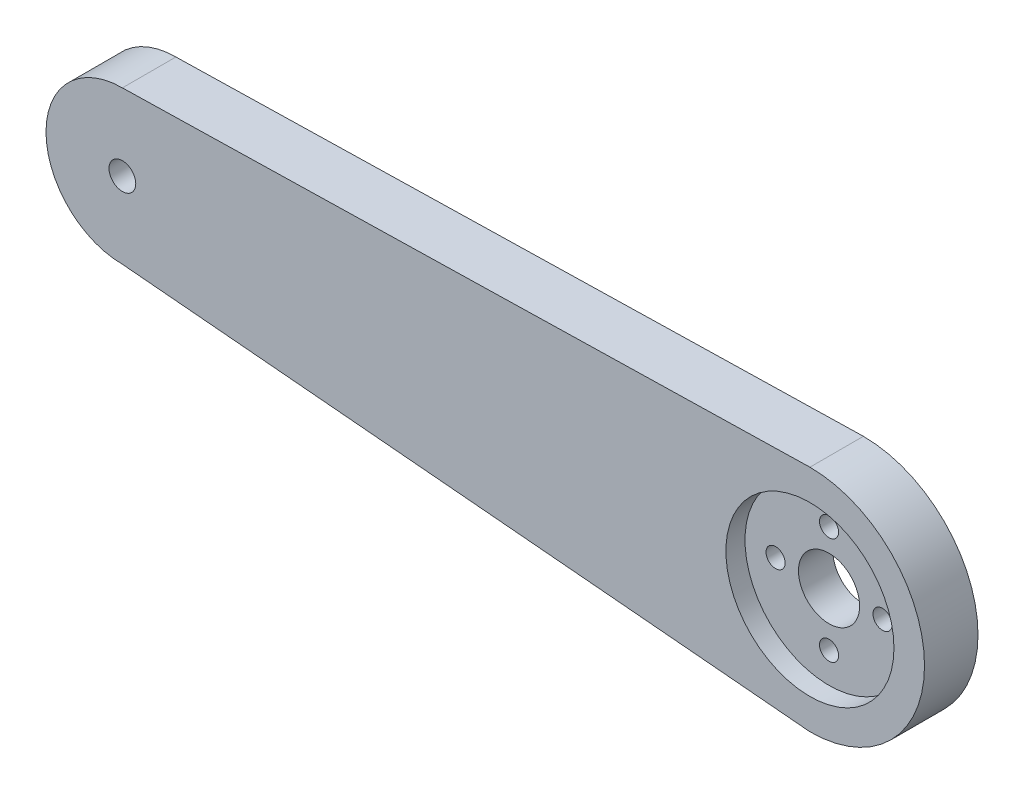
ISO-10303-21;
HEADER;
FILE_DESCRIPTION(('STEP AP214'),'2;1');
FILE_NAME('part.step','',(''),(''),'','','');
FILE_SCHEMA(('AUTOMOTIVE_DESIGN { 1 0 10303 214 1 1 1 1 }'));
ENDSEC;
DATA;
#1=APPLICATION_CONTEXT('core data for automotive mechanical design processes');
#2=APPLICATION_PROTOCOL_DEFINITION('international standard','automotive_design',2000,#1);
#3=PRODUCT_CONTEXT('',#1,'mechanical');
#4=PRODUCT('Part','Part','',(#3));
#5=PRODUCT_RELATED_PRODUCT_CATEGORY('part','',(#4));
#6=PRODUCT_DEFINITION_FORMATION('','',#4);
#7=PRODUCT_DEFINITION_CONTEXT('part definition',#1,'design');
#8=PRODUCT_DEFINITION('design','',#6,#7);
#9=PRODUCT_DEFINITION_SHAPE('','',#8);
#10=(LENGTH_UNIT() NAMED_UNIT(*) SI_UNIT(.MILLI.,.METRE.));
#11=(NAMED_UNIT(*) PLANE_ANGLE_UNIT() SI_UNIT($,.RADIAN.));
#12=(NAMED_UNIT(*) SI_UNIT($,.STERADIAN.) SOLID_ANGLE_UNIT());
#13=UNCERTAINTY_MEASURE_WITH_UNIT(LENGTH_MEASURE(1.E-05),#10,'distance_accuracy_value','');
#14=(GEOMETRIC_REPRESENTATION_CONTEXT(3) GLOBAL_UNCERTAINTY_ASSIGNED_CONTEXT((#13)) GLOBAL_UNIT_ASSIGNED_CONTEXT((#10,
#11,#12)) REPRESENTATION_CONTEXT('',''));
#15=CARTESIAN_POINT('',(0.,0.,0.));
#16=DIRECTION('',(0.,0.,1.));
#17=DIRECTION('',(1.,0.,0.));
#18=AXIS2_PLACEMENT_3D('',#15,#16,#17);
#19=CARTESIAN_POINT('',(0.,0.,-3.));
#20=DIRECTION('',(0.,0.,1.));
#21=DIRECTION('',(1.,0.,0.));
#22=AXIS2_PLACEMENT_3D('',#19,#20,#21);
#23=CYLINDRICAL_SURFACE('',#22,1.75);
#24=CARTESIAN_POINT('',(0.,0.,7.));
#25=DIRECTION('',(0.,0.,1.));
#26=DIRECTION('',(1.,0.,0.));
#27=AXIS2_PLACEMENT_3D('',#24,#25,#26);
#28=CIRCLE('',#27,1.75);
#29=CARTESIAN_POINT('',(1.75,0.,7.));
#30=VERTEX_POINT('',#29);
#31=EDGE_CURVE('E126',#30,#30,#28,.T.);
#32=ORIENTED_EDGE('',*,*,#31,.T.);
#33=EDGE_LOOP('',(#32));
#34=FACE_BOUND('',#33,.T.);
#35=CARTESIAN_POINT('',(0.,0.,3.));
#36=DIRECTION('',(0.,0.,-1.));
#37=DIRECTION('',(-1.,0.,0.));
#38=AXIS2_PLACEMENT_3D('',#35,#36,#37);
#39=CIRCLE('',#38,1.75);
#40=CARTESIAN_POINT('',(-1.75,0.,3.));
#41=VERTEX_POINT('',#40);
#42=EDGE_CURVE('E40',#41,#41,#39,.F.);
#43=ORIENTED_EDGE('',*,*,#42,.F.);
#44=EDGE_LOOP('',(#43));
#45=FACE_BOUND('',#44,.T.);
#46=ADVANCED_FACE('F36',(#34,#45),#23,.F.);
#47=CARTESIAN_POINT('',(90.,-3.00000000000001,10.));
#48=DIRECTION('',(0.,0.,-1.));
#49=DIRECTION('',(-1.,0.,0.));
#50=AXIS2_PLACEMENT_3D('',#47,#48,#49);
#51=CYLINDRICAL_SURFACE('',#50,4.00000000000001);
#52=CARTESIAN_POINT('',(90.,-3.00000000000001,0.));
#53=DIRECTION('',(0.,0.,-1.));
#54=DIRECTION('',(-1.,0.,0.));
#55=AXIS2_PLACEMENT_3D('',#52,#53,#54);
#56=CIRCLE('',#55,4.00000000000001);
#57=CARTESIAN_POINT('',(86.,-3.00000000000001,0.));
#58=VERTEX_POINT('',#57);
#59=EDGE_CURVE('E106',#58,#58,#56,.T.);
#60=ORIENTED_EDGE('',*,*,#59,.T.);
#61=EDGE_LOOP('',(#60));
#62=FACE_BOUND('',#61,.T.);
#63=CARTESIAN_POINT('',(90.,-3.00000000000001,4.5));
#64=DIRECTION('',(0.,0.,1.));
#65=DIRECTION('',(1.,0.,0.));
#66=AXIS2_PLACEMENT_3D('',#63,#64,#65);
#67=CIRCLE('',#66,4.00000000000001);
#68=CARTESIAN_POINT('',(94.,-3.00000000000001,4.5));
#69=VERTEX_POINT('',#68);
#70=EDGE_CURVE('E136',#69,#69,#67,.F.);
#71=ORIENTED_EDGE('',*,*,#70,.F.);
#72=EDGE_LOOP('',(#71));
#73=FACE_BOUND('',#72,.T.);
#74=ADVANCED_FACE('F154',(#62,#73),#51,.F.);
#75=CARTESIAN_POINT('',(90.,3.99999999999999,10.));
#76=DIRECTION('',(0.,0.,-1.));
#77=DIRECTION('',(-1.,0.,0.));
#78=AXIS2_PLACEMENT_3D('',#75,#76,#77);
#79=CYLINDRICAL_SURFACE('',#78,1.25);
#80=CARTESIAN_POINT('',(90.,3.99999999999999,0.));
#81=DIRECTION('',(0.,0.,-1.));
#82=DIRECTION('',(-1.,0.,0.));
#83=AXIS2_PLACEMENT_3D('',#80,#81,#82);
#84=CIRCLE('',#83,1.25);
#85=CARTESIAN_POINT('',(88.75,3.99999999999999,0.));
#86=VERTEX_POINT('',#85);
#87=EDGE_CURVE('E144',#86,#86,#84,.T.);
#88=ORIENTED_EDGE('',*,*,#87,.T.);
#89=EDGE_LOOP('',(#88));
#90=FACE_BOUND('',#89,.T.);
#91=CARTESIAN_POINT('',(90.,3.99999999999999,4.5));
#92=DIRECTION('',(0.,0.,1.));
#93=DIRECTION('',(1.,0.,0.));
#94=AXIS2_PLACEMENT_3D('',#91,#92,#93);
#95=CIRCLE('',#94,1.25);
#96=CARTESIAN_POINT('',(91.25,3.99999999999999,4.5));
#97=VERTEX_POINT('',#96);
#98=EDGE_CURVE('E133',#97,#97,#95,.F.);
#99=ORIENTED_EDGE('',*,*,#98,.F.);
#100=EDGE_LOOP('',(#99));
#101=FACE_BOUND('',#100,.T.);
#102=ADVANCED_FACE('F181',(#90,#101),#79,.F.);
#103=CARTESIAN_POINT('',(83.,-3.00000000000001,10.));
#104=DIRECTION('',(0.,0.,-1.));
#105=DIRECTION('',(-1.,0.,0.));
#106=AXIS2_PLACEMENT_3D('',#103,#104,#105);
#107=CYLINDRICAL_SURFACE('',#106,1.25);
#108=CARTESIAN_POINT('',(83.,-3.00000000000001,0.));
#109=DIRECTION('',(0.,0.,-1.));
#110=DIRECTION('',(-1.,0.,0.));
#111=AXIS2_PLACEMENT_3D('',#108,#109,#110);
#112=CIRCLE('',#111,1.25);
#113=CARTESIAN_POINT('',(81.75,-3.00000000000001,0.));
#114=VERTEX_POINT('',#113);
#115=EDGE_CURVE('E140',#114,#114,#112,.T.);
#116=ORIENTED_EDGE('',*,*,#115,.T.);
#117=EDGE_LOOP('',(#116));
#118=FACE_BOUND('',#117,.T.);
#119=CARTESIAN_POINT('',(83.,-3.00000000000001,4.5));
#120=DIRECTION('',(0.,0.,1.));
#121=DIRECTION('',(1.,0.,0.));
#122=AXIS2_PLACEMENT_3D('',#119,#120,#121);
#123=CIRCLE('',#122,1.25);
#124=CARTESIAN_POINT('',(84.25,-3.00000000000001,4.5));
#125=VERTEX_POINT('',#124);
#126=EDGE_CURVE('E118',#125,#125,#123,.F.);
#127=ORIENTED_EDGE('',*,*,#126,.F.);
#128=EDGE_LOOP('',(#127));
#129=FACE_BOUND('',#128,.T.);
#130=ADVANCED_FACE('F196',(#118,#129),#107,.F.);
#131=CARTESIAN_POINT('',(90.,-10.,10.));
#132=DIRECTION('',(0.,0.,-1.));
#133=DIRECTION('',(-1.,0.,0.));
#134=AXIS2_PLACEMENT_3D('',#131,#132,#133);
#135=CYLINDRICAL_SURFACE('',#134,1.25);
#136=CARTESIAN_POINT('',(90.,-10.,0.));
#137=DIRECTION('',(0.,0.,-1.));
#138=DIRECTION('',(-1.,0.,0.));
#139=AXIS2_PLACEMENT_3D('',#136,#137,#138);
#140=CIRCLE('',#139,1.25);
#141=CARTESIAN_POINT('',(88.75,-10.,0.));
#142=VERTEX_POINT('',#141);
#143=EDGE_CURVE('E143',#142,#142,#140,.T.);
#144=ORIENTED_EDGE('',*,*,#143,.T.);
#145=EDGE_LOOP('',(#144));
#146=FACE_BOUND('',#145,.T.);
#147=CARTESIAN_POINT('',(90.,-10.,4.5));
#148=DIRECTION('',(0.,0.,1.));
#149=DIRECTION('',(1.,0.,0.));
#150=AXIS2_PLACEMENT_3D('',#147,#148,#149);
#151=CIRCLE('',#150,1.25);
#152=CARTESIAN_POINT('',(91.25,-10.,4.5));
#153=VERTEX_POINT('',#152);
#154=EDGE_CURVE('E113',#153,#153,#151,.F.);
#155=ORIENTED_EDGE('',*,*,#154,.F.);
#156=EDGE_LOOP('',(#155));
#157=FACE_BOUND('',#156,.T.);
#158=ADVANCED_FACE('F199',(#146,#157),#135,.F.);
#159=CARTESIAN_POINT('',(97.,-3.,10.));
#160=DIRECTION('',(0.,0.,-1.));
#161=DIRECTION('',(-1.,0.,0.));
#162=AXIS2_PLACEMENT_3D('',#159,#160,#161);
#163=CYLINDRICAL_SURFACE('',#162,1.25);
#164=CARTESIAN_POINT('',(97.,-3.,0.));
#165=DIRECTION('',(0.,0.,-1.));
#166=DIRECTION('',(-1.,0.,0.));
#167=AXIS2_PLACEMENT_3D('',#164,#165,#166);
#168=CIRCLE('',#167,1.25);
#169=CARTESIAN_POINT('',(95.75,-3.,0.));
#170=VERTEX_POINT('',#169);
#171=EDGE_CURVE('E139',#170,#170,#168,.T.);
#172=ORIENTED_EDGE('',*,*,#171,.T.);
#173=EDGE_LOOP('',(#172));
#174=FACE_BOUND('',#173,.T.);
#175=CARTESIAN_POINT('',(97.,-3.,4.5));
#176=DIRECTION('',(0.,0.,1.));
#177=DIRECTION('',(1.,0.,0.));
#178=AXIS2_PLACEMENT_3D('',#175,#176,#177);
#179=CIRCLE('',#178,1.25);
#180=CARTESIAN_POINT('',(98.25,-3.,4.5));
#181=VERTEX_POINT('',#180);
#182=EDGE_CURVE('E111',#181,#181,#179,.F.);
#183=ORIENTED_EDGE('',*,*,#182,.F.);
#184=EDGE_LOOP('',(#183));
#185=FACE_BOUND('',#184,.T.);
#186=ADVANCED_FACE('F206',(#174,#185),#163,.F.);
#187=CARTESIAN_POINT('',(0.,0.,7.));
#188=DIRECTION('',(0.,0.,-1.));
#189=DIRECTION('',(-1.,0.,0.));
#190=AXIS2_PLACEMENT_3D('',#187,#188,#189);
#191=CYLINDRICAL_SURFACE('',#190,10.);
#192=CARTESIAN_POINT('',(0.,0.,0.));
#193=DIRECTION('',(0.,0.,1.));
#194=DIRECTION('',(1.,0.,0.));
#195=AXIS2_PLACEMENT_3D('',#192,#193,#194);
#196=CIRCLE('',#195,10.);
#197=CARTESIAN_POINT('',(0.,10.,0.));
#198=VERTEX_POINT('',#197);
#199=CARTESIAN_POINT('',(0.,-10.,0.));
#200=VERTEX_POINT('',#199);
#201=EDGE_CURVE('E103',#198,#200,#196,.T.);
#202=ORIENTED_EDGE('',*,*,#201,.T.);
#203=DIRECTION('',(0.,0.,-1.));
#204=VECTOR('',#203,1.);
#205=CARTESIAN_POINT('',(0.,-10.,7.));
#206=LINE('',#205,#204);
#207=CARTESIAN_POINT('',(0.,-10.,7.));
#208=VERTEX_POINT('',#207);
#209=EDGE_CURVE('E11',#208,#200,#206,.T.);
#210=ORIENTED_EDGE('',*,*,#209,.F.);
#211=CARTESIAN_POINT('',(0.,0.,7.));
#212=DIRECTION('',(0.,0.,1.));
#213=DIRECTION('',(1.,0.,0.));
#214=AXIS2_PLACEMENT_3D('',#211,#212,#213);
#215=CIRCLE('',#214,10.);
#216=CARTESIAN_POINT('',(0.,10.,7.));
#217=VERTEX_POINT('',#216);
#218=EDGE_CURVE('E90',#217,#208,#215,.T.);
#219=ORIENTED_EDGE('',*,*,#218,.F.);
#220=DIRECTION('',(0.,0.,-1.));
#221=VECTOR('',#220,1.);
#222=CARTESIAN_POINT('',(0.,10.,7.));
#223=LINE('',#222,#221);
#224=EDGE_CURVE('E99',#217,#198,#223,.T.);
#225=ORIENTED_EDGE('',*,*,#224,.T.);
#226=EDGE_LOOP('',(#202,#210,#219,#225));
#227=FACE_BOUND('',#226,.T.);
#228=ADVANCED_FACE('F38',(#227),#191,.T.);
#229=CARTESIAN_POINT('',(0.,-10.,7.));
#230=DIRECTION('',(0.0885397902837944,0.996072640692687,0.));
#231=DIRECTION('',(-0.996072640692687,0.0885397902837944,0.));
#232=AXIS2_PLACEMENT_3D('',#229,#230,#231);
#233=PLANE('',#232);
#234=DIRECTION('',(0.996072640692687,-0.0885397902837944,0.));
#235=VECTOR('',#234,1.);
#236=CARTESIAN_POINT('',(0.,-10.,0.));
#237=LINE('',#236,#235);
#238=CARTESIAN_POINT('',(90.,-18.,0.));
#239=VERTEX_POINT('',#238);
#240=EDGE_CURVE('E94',#200,#239,#237,.T.);
#241=ORIENTED_EDGE('',*,*,#240,.T.);
#242=DIRECTION('',(0.,0.,-1.));
#243=VECTOR('',#242,1.);
#244=CARTESIAN_POINT('',(90.,-18.,7.));
#245=LINE('',#244,#243);
#246=CARTESIAN_POINT('',(90.,-18.,7.));
#247=VERTEX_POINT('',#246);
#248=EDGE_CURVE('E46',#247,#239,#245,.T.);
#249=ORIENTED_EDGE('',*,*,#248,.F.);
#250=DIRECTION('',(0.996072640692687,-0.0885397902837944,0.));
#251=VECTOR('',#250,1.);
#252=CARTESIAN_POINT('',(0.,-10.,7.));
#253=LINE('',#252,#251);
#254=EDGE_CURVE('E85',#208,#247,#253,.T.);
#255=ORIENTED_EDGE('',*,*,#254,.F.);
#256=ORIENTED_EDGE('',*,*,#209,.T.);
#257=EDGE_LOOP('',(#241,#249,#255,#256));
#258=FACE_BOUND('',#257,.T.);
#259=ADVANCED_FACE('F93',(#258),#233,.F.);
#260=CARTESIAN_POINT('',(90.,-3.00000000000001,7.));
#261=DIRECTION('',(0.,0.,-1.));
#262=DIRECTION('',(-1.,0.,0.));
#263=AXIS2_PLACEMENT_3D('',#260,#261,#262);
#264=CYLINDRICAL_SURFACE('',#263,15.);
#265=CARTESIAN_POINT('',(90.,-3.00000000000001,0.));
#266=DIRECTION('',(0.,0.,1.));
#267=DIRECTION('',(1.,0.,0.));
#268=AXIS2_PLACEMENT_3D('',#265,#266,#267);
#269=CIRCLE('',#268,15.);
#270=CARTESIAN_POINT('',(90.,12.,0.));
#271=VERTEX_POINT('',#270);
#272=EDGE_CURVE('E72',#239,#271,#269,.T.);
#273=ORIENTED_EDGE('',*,*,#272,.T.);
#274=DIRECTION('',(0.,0.,-1.));
#275=VECTOR('',#274,1.);
#276=CARTESIAN_POINT('',(90.,12.,7.));
#277=LINE('',#276,#275);
#278=CARTESIAN_POINT('',(90.,12.,7.));
#279=VERTEX_POINT('',#278);
#280=EDGE_CURVE('E95',#279,#271,#277,.T.);
#281=ORIENTED_EDGE('',*,*,#280,.F.);
#282=CARTESIAN_POINT('',(90.,-3.00000000000001,7.));
#283=DIRECTION('',(0.,0.,1.));
#284=DIRECTION('',(1.,0.,0.));
#285=AXIS2_PLACEMENT_3D('',#282,#283,#284);
#286=CIRCLE('',#285,15.);
#287=EDGE_CURVE('E88',#247,#279,#286,.T.);
#288=ORIENTED_EDGE('',*,*,#287,.F.);
#289=ORIENTED_EDGE('',*,*,#248,.T.);
#290=EDGE_LOOP('',(#273,#281,#288,#289));
#291=FACE_BOUND('',#290,.T.);
#292=ADVANCED_FACE('F97',(#291),#264,.T.);
#293=CARTESIAN_POINT('',(0.,10.,7.));
#294=DIRECTION('',(0.0222167372851468,-0.99975317783161,0.));
#295=DIRECTION('',(0.99975317783161,0.0222167372851468,0.));
#296=AXIS2_PLACEMENT_3D('',#293,#294,#295);
#297=PLANE('',#296);
#298=DIRECTION('',(-0.99975317783161,-0.0222167372851468,0.));
#299=VECTOR('',#298,1.);
#300=CARTESIAN_POINT('',(0.,10.,0.));
#301=LINE('',#300,#299);
#302=EDGE_CURVE('E78',#271,#198,#301,.T.);
#303=ORIENTED_EDGE('',*,*,#302,.T.);
#304=ORIENTED_EDGE('',*,*,#224,.F.);
#305=DIRECTION('',(-0.99975317783161,-0.0222167372851468,0.));
#306=VECTOR('',#305,1.);
#307=CARTESIAN_POINT('',(0.,10.,7.));
#308=LINE('',#307,#306);
#309=EDGE_CURVE('E55',#279,#217,#308,.T.);
#310=ORIENTED_EDGE('',*,*,#309,.F.);
#311=ORIENTED_EDGE('',*,*,#280,.T.);
#312=EDGE_LOOP('',(#303,#304,#310,#311));
#313=FACE_BOUND('',#312,.T.);
#314=ADVANCED_FACE('F165',(#313),#297,.F.);
#315=CARTESIAN_POINT('',(0.,0.,7.));
#316=DIRECTION('',(0.,0.,1.));
#317=DIRECTION('',(1.,0.,0.));
#318=AXIS2_PLACEMENT_3D('',#315,#316,#317);
#319=PLANE('',#318);
#320=ORIENTED_EDGE('',*,*,#31,.F.);
#321=EDGE_LOOP('',(#320));
#322=FACE_BOUND('',#321,.T.);
#323=CARTESIAN_POINT('',(90.,-3.00000000000001,7.));
#324=DIRECTION('',(0.,0.,1.));
#325=DIRECTION('',(1.,0.,0.));
#326=AXIS2_PLACEMENT_3D('',#323,#324,#325);
#327=CIRCLE('',#326,11.);
#328=CARTESIAN_POINT('',(101.,-3.00000000000001,7.));
#329=VERTEX_POINT('',#328);
#330=EDGE_CURVE('E121',#329,#329,#327,.T.);
#331=ORIENTED_EDGE('',*,*,#330,.F.);
#332=EDGE_LOOP('',(#331));
#333=FACE_BOUND('',#332,.T.);
#334=ORIENTED_EDGE('',*,*,#218,.T.);
#335=ORIENTED_EDGE('',*,*,#254,.T.);
#336=ORIENTED_EDGE('',*,*,#287,.T.);
#337=ORIENTED_EDGE('',*,*,#309,.T.);
#338=EDGE_LOOP('',(#334,#335,#336,#337));
#339=FACE_BOUND('',#338,.T.);
#340=ADVANCED_FACE('F86',(#322,#333,#339),#319,.T.);
#341=CARTESIAN_POINT('',(0.,0.,0.));
#342=DIRECTION('',(0.,0.,1.));
#343=DIRECTION('',(1.,0.,0.));
#344=AXIS2_PLACEMENT_3D('',#341,#342,#343);
#345=PLANE('',#344);
#346=CARTESIAN_POINT('',(0.,0.,0.));
#347=DIRECTION('',(0.,0.,-1.));
#348=DIRECTION('',(-1.,0.,0.));
#349=AXIS2_PLACEMENT_3D('',#346,#347,#348);
#350=CIRCLE('',#349,4.01);
#351=CARTESIAN_POINT('',(-4.01,0.,0.));
#352=VERTEX_POINT('',#351);
#353=EDGE_CURVE('E330',#352,#352,#350,.T.);
#354=ORIENTED_EDGE('',*,*,#353,.F.);
#355=EDGE_LOOP('',(#354));
#356=FACE_BOUND('',#355,.T.);
#357=ORIENTED_EDGE('',*,*,#171,.F.);
#358=EDGE_LOOP('',(#357));
#359=FACE_BOUND('',#358,.T.);
#360=ORIENTED_EDGE('',*,*,#143,.F.);
#361=EDGE_LOOP('',(#360));
#362=FACE_BOUND('',#361,.T.);
#363=ORIENTED_EDGE('',*,*,#115,.F.);
#364=EDGE_LOOP('',(#363));
#365=FACE_BOUND('',#364,.T.);
#366=ORIENTED_EDGE('',*,*,#87,.F.);
#367=EDGE_LOOP('',(#366));
#368=FACE_BOUND('',#367,.T.);
#369=ORIENTED_EDGE('',*,*,#59,.F.);
#370=EDGE_LOOP('',(#369));
#371=FACE_BOUND('',#370,.T.);
#372=ORIENTED_EDGE('',*,*,#201,.F.);
#373=ORIENTED_EDGE('',*,*,#302,.F.);
#374=ORIENTED_EDGE('',*,*,#272,.F.);
#375=ORIENTED_EDGE('',*,*,#240,.F.);
#376=EDGE_LOOP('',(#372,#373,#374,#375));
#377=FACE_BOUND('',#376,.T.);
#378=ADVANCED_FACE('F157',(#356,#359,#362,#365,#368,#371,#377),#345,.F.);
#379=CARTESIAN_POINT('',(90.,-3.00000000000001,4.5));
#380=DIRECTION('',(0.,0.,1.));
#381=DIRECTION('',(1.,0.,0.));
#382=AXIS2_PLACEMENT_3D('',#379,#380,#381);
#383=PLANE('',#382);
#384=CARTESIAN_POINT('',(90.,-3.00000000000001,4.5));
#385=DIRECTION('',(0.,0.,1.));
#386=DIRECTION('',(1.,0.,0.));
#387=AXIS2_PLACEMENT_3D('',#384,#385,#386);
#388=CIRCLE('',#387,11.);
#389=CARTESIAN_POINT('',(101.,-3.00000000000001,4.5));
#390=VERTEX_POINT('',#389);
#391=EDGE_CURVE('E114',#390,#390,#388,.T.);
#392=ORIENTED_EDGE('',*,*,#391,.T.);
#393=EDGE_LOOP('',(#392));
#394=FACE_BOUND('',#393,.T.);
#395=ORIENTED_EDGE('',*,*,#182,.T.);
#396=EDGE_LOOP('',(#395));
#397=FACE_BOUND('',#396,.T.);
#398=ORIENTED_EDGE('',*,*,#154,.T.);
#399=EDGE_LOOP('',(#398));
#400=FACE_BOUND('',#399,.T.);
#401=ORIENTED_EDGE('',*,*,#126,.T.);
#402=EDGE_LOOP('',(#401));
#403=FACE_BOUND('',#402,.T.);
#404=ORIENTED_EDGE('',*,*,#98,.T.);
#405=EDGE_LOOP('',(#404));
#406=FACE_BOUND('',#405,.T.);
#407=ORIENTED_EDGE('',*,*,#70,.T.);
#408=EDGE_LOOP('',(#407));
#409=FACE_BOUND('',#408,.T.);
#410=ADVANCED_FACE('F160',(#394,#397,#400,#403,#406,#409),#383,.T.);
#411=CARTESIAN_POINT('',(90.,-3.00000000000001,4.5));
#412=DIRECTION('',(0.,0.,1.));
#413=DIRECTION('',(1.,0.,0.));
#414=AXIS2_PLACEMENT_3D('',#411,#412,#413);
#415=CYLINDRICAL_SURFACE('',#414,11.);
#416=ORIENTED_EDGE('',*,*,#391,.F.);
#417=EDGE_LOOP('',(#416));
#418=FACE_BOUND('',#417,.T.);
#419=ORIENTED_EDGE('',*,*,#330,.T.);
#420=EDGE_LOOP('',(#419));
#421=FACE_BOUND('',#420,.T.);
#422=ADVANCED_FACE('F191',(#418,#421),#415,.F.);
#423=CARTESIAN_POINT('',(0.,0.,3.));
#424=DIRECTION('',(0.,0.,-1.));
#425=DIRECTION('',(-1.,0.,0.));
#426=AXIS2_PLACEMENT_3D('',#423,#424,#425);
#427=PLANE('',#426);
#428=CARTESIAN_POINT('',(0.,0.,3.));
#429=DIRECTION('',(0.,0.,-1.));
#430=DIRECTION('',(-1.,0.,0.));
#431=AXIS2_PLACEMENT_3D('',#428,#429,#430);
#432=CIRCLE('',#431,4.01);
#433=CARTESIAN_POINT('',(-4.01,0.,3.));
#434=VERTEX_POINT('',#433);
#435=EDGE_CURVE('E327',#434,#434,#432,.T.);
#436=ORIENTED_EDGE('',*,*,#435,.T.);
#437=EDGE_LOOP('',(#436));
#438=FACE_BOUND('',#437,.T.);
#439=ORIENTED_EDGE('',*,*,#42,.T.);
#440=EDGE_LOOP('',(#439));
#441=FACE_BOUND('',#440,.T.);
#442=ADVANCED_FACE('F194',(#438,#441),#427,.T.);
#443=CARTESIAN_POINT('',(0.,0.,3.));
#444=DIRECTION('',(0.,0.,-1.));
#445=DIRECTION('',(-1.,0.,0.));
#446=AXIS2_PLACEMENT_3D('',#443,#444,#445);
#447=CYLINDRICAL_SURFACE('',#446,4.01);
#448=ORIENTED_EDGE('',*,*,#435,.F.);
#449=EDGE_LOOP('',(#448));
#450=FACE_BOUND('',#449,.T.);
#451=ORIENTED_EDGE('',*,*,#353,.T.);
#452=EDGE_LOOP('',(#451));
#453=FACE_BOUND('',#452,.T.);
#454=ADVANCED_FACE('F187',(#450,#453),#447,.F.);
#455=CLOSED_SHELL('',(#46,#74,#102,#130,#158,#186,#228,#259,#292,#314,#340,#378,#410,#422,#442,#454));
#456=MANIFOLD_SOLID_BREP('B2',#455);
#457=ADVANCED_BREP_SHAPE_REPRESENTATION('',(#18,#456),#14);
#458=SHAPE_DEFINITION_REPRESENTATION(#9,#457);
ENDSEC;
END-ISO-10303-21;
